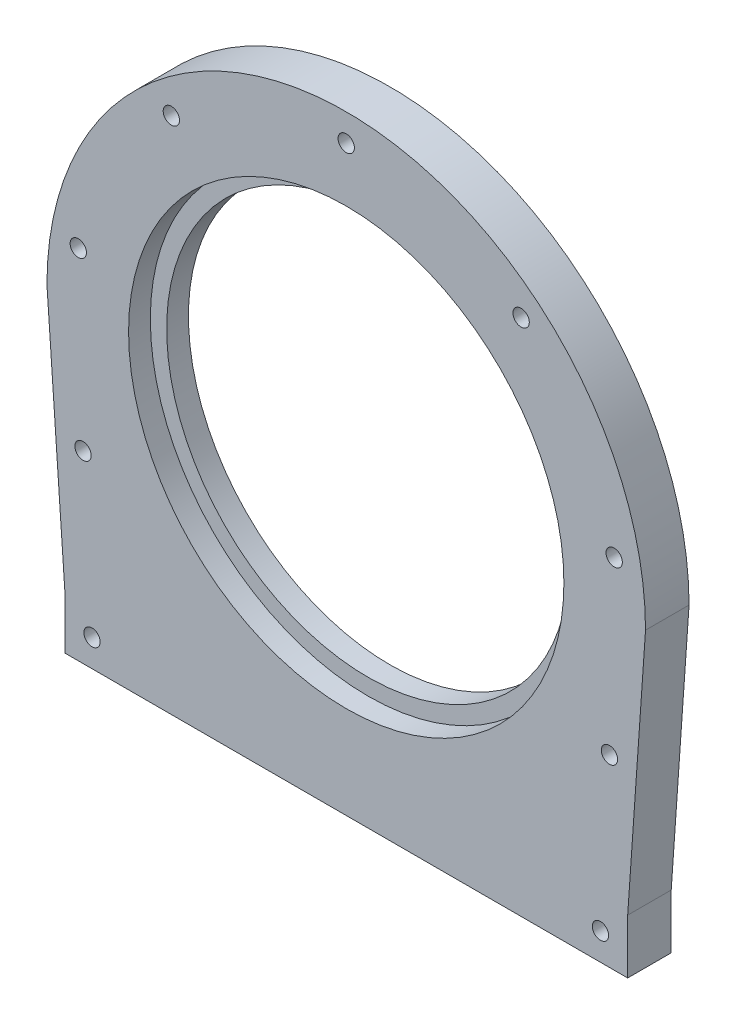
ISO-10303-21;
HEADER;
FILE_DESCRIPTION(('STEP AP214'),'2;1');
FILE_NAME('part.step','',(''),(''),'','','');
FILE_SCHEMA(('AUTOMOTIVE_DESIGN { 1 0 10303 214 1 1 1 1 }'));
ENDSEC;
DATA;
#1=APPLICATION_CONTEXT('core data for automotive mechanical design processes');
#2=APPLICATION_PROTOCOL_DEFINITION('international standard','automotive_design',2000,#1);
#3=PRODUCT_CONTEXT('',#1,'mechanical');
#4=PRODUCT('Part','Part','',(#3));
#5=PRODUCT_RELATED_PRODUCT_CATEGORY('part','',(#4));
#6=PRODUCT_DEFINITION_FORMATION('','',#4);
#7=PRODUCT_DEFINITION_CONTEXT('part definition',#1,'design');
#8=PRODUCT_DEFINITION('design','',#6,#7);
#9=PRODUCT_DEFINITION_SHAPE('','',#8);
#10=(LENGTH_UNIT() NAMED_UNIT(*) SI_UNIT(.MILLI.,.METRE.));
#11=(NAMED_UNIT(*) PLANE_ANGLE_UNIT() SI_UNIT($,.RADIAN.));
#12=(NAMED_UNIT(*) SI_UNIT($,.STERADIAN.) SOLID_ANGLE_UNIT());
#13=UNCERTAINTY_MEASURE_WITH_UNIT(LENGTH_MEASURE(1.E-05),#10,'distance_accuracy_value','');
#14=(GEOMETRIC_REPRESENTATION_CONTEXT(3) GLOBAL_UNCERTAINTY_ASSIGNED_CONTEXT((#13)) GLOBAL_UNIT_ASSIGNED_CONTEXT((#10,
#11,#12)) REPRESENTATION_CONTEXT('',''));
#15=CARTESIAN_POINT('',(0.,0.,0.));
#16=DIRECTION('',(0.,0.,1.));
#17=DIRECTION('',(1.,0.,0.));
#18=AXIS2_PLACEMENT_3D('',#15,#16,#17);
#19=CARTESIAN_POINT('',(-46.7191267927402,-52.,8.));
#20=DIRECTION('',(0.,0.,-1.));
#21=DIRECTION('',(-1.,0.,0.));
#22=AXIS2_PLACEMENT_3D('',#19,#20,#21);
#23=CYLINDRICAL_SURFACE('',#22,1.5);
#24=CARTESIAN_POINT('',(-46.7191267927402,-52.,8.));
#25=DIRECTION('',(0.,0.,1.));
#26=DIRECTION('',(1.,0.,0.));
#27=AXIS2_PLACEMENT_3D('',#24,#25,#26);
#28=CIRCLE('',#27,1.5);
#29=CARTESIAN_POINT('',(-45.2191267927402,-52.,8.));
#30=VERTEX_POINT('',#29);
#31=EDGE_CURVE('E293',#30,#30,#28,.T.);
#32=ORIENTED_EDGE('',*,*,#31,.T.);
#33=EDGE_LOOP('',(#32));
#34=FACE_BOUND('',#33,.T.);
#35=CARTESIAN_POINT('',(-46.7191267927402,-52.,4.));
#36=DIRECTION('',(0.,0.,-1.));
#37=DIRECTION('',(-1.,0.,0.));
#38=AXIS2_PLACEMENT_3D('',#35,#36,#37);
#39=CIRCLE('',#38,1.5);
#40=CARTESIAN_POINT('',(-48.2191267927402,-52.,4.));
#41=VERTEX_POINT('',#40);
#42=EDGE_CURVE('E357',#41,#41,#39,.T.);
#43=ORIENTED_EDGE('',*,*,#42,.T.);
#44=EDGE_LOOP('',(#43));
#45=FACE_BOUND('',#44,.T.);
#46=ADVANCED_FACE('F40',(#34,#45),#23,.F.);
#47=CARTESIAN_POINT('',(-48.3717011839057,-23.1518182235239,8.));
#48=DIRECTION('',(0.,0.,-1.));
#49=DIRECTION('',(-1.,0.,0.));
#50=AXIS2_PLACEMENT_3D('',#47,#48,#49);
#51=CYLINDRICAL_SURFACE('',#50,1.5);
#52=CARTESIAN_POINT('',(-48.3717011839057,-23.1518182235239,8.));
#53=DIRECTION('',(0.,0.,1.));
#54=DIRECTION('',(1.,0.,0.));
#55=AXIS2_PLACEMENT_3D('',#52,#53,#54);
#56=CIRCLE('',#55,1.5);
#57=CARTESIAN_POINT('',(-46.8717011839057,-23.1518182235239,8.));
#58=VERTEX_POINT('',#57);
#59=EDGE_CURVE('E289',#58,#58,#56,.T.);
#60=ORIENTED_EDGE('',*,*,#59,.T.);
#61=EDGE_LOOP('',(#60));
#62=FACE_BOUND('',#61,.T.);
#63=CARTESIAN_POINT('',(-48.3717011839057,-23.1518182235239,4.));
#64=DIRECTION('',(0.,0.,-1.));
#65=DIRECTION('',(-1.,0.,0.));
#66=AXIS2_PLACEMENT_3D('',#63,#64,#65);
#67=CIRCLE('',#66,1.5);
#68=CARTESIAN_POINT('',(-49.8717011839057,-23.1518182235239,4.));
#69=VERTEX_POINT('',#68);
#70=EDGE_CURVE('E337',#69,#69,#67,.T.);
#71=ORIENTED_EDGE('',*,*,#70,.T.);
#72=EDGE_LOOP('',(#71));
#73=FACE_BOUND('',#72,.T.);
#74=ADVANCED_FACE('F184',(#62,#73),#51,.F.);
#75=CARTESIAN_POINT('',(-49.2403876506049,8.68240888334158,8.));
#76=DIRECTION('',(0.,0.,-1.));
#77=DIRECTION('',(-1.,0.,0.));
#78=AXIS2_PLACEMENT_3D('',#75,#76,#77);
#79=CYLINDRICAL_SURFACE('',#78,1.50000000000543);
#80=CARTESIAN_POINT('',(-49.2403876506049,8.68240888334158,8.));
#81=DIRECTION('',(0.,0.,1.));
#82=DIRECTION('',(1.,0.,0.));
#83=AXIS2_PLACEMENT_3D('',#80,#81,#82);
#84=CIRCLE('',#83,1.50000000000543);
#85=CARTESIAN_POINT('',(-47.7403876505995,8.68240888334158,8.));
#86=VERTEX_POINT('',#85);
#87=EDGE_CURVE('E285',#86,#86,#84,.T.);
#88=ORIENTED_EDGE('',*,*,#87,.T.);
#89=EDGE_LOOP('',(#88));
#90=FACE_BOUND('',#89,.T.);
#91=CARTESIAN_POINT('',(-49.2403876506049,8.68240888334158,4.));
#92=DIRECTION('',(0.,0.,-1.));
#93=DIRECTION('',(-1.,0.,0.));
#94=AXIS2_PLACEMENT_3D('',#91,#92,#93);
#95=CIRCLE('',#94,1.50000000000543);
#96=CARTESIAN_POINT('',(-50.7403876506103,8.68240888334158,4.));
#97=VERTEX_POINT('',#96);
#98=EDGE_CURVE('E355',#97,#97,#95,.T.);
#99=ORIENTED_EDGE('',*,*,#98,.T.);
#100=EDGE_LOOP('',(#99));
#101=FACE_BOUND('',#100,.T.);
#102=ADVANCED_FACE('F191',(#90,#101),#79,.F.);
#103=CARTESIAN_POINT('',(-32.139380484325,38.3022221559452,8.));
#104=DIRECTION('',(0.,0.,-1.));
#105=DIRECTION('',(-1.,0.,0.));
#106=AXIS2_PLACEMENT_3D('',#103,#104,#105);
#107=CYLINDRICAL_SURFACE('',#106,1.5000000000019);
#108=CARTESIAN_POINT('',(-32.139380484325,38.3022221559452,8.));
#109=DIRECTION('',(0.,0.,1.));
#110=DIRECTION('',(1.,0.,0.));
#111=AXIS2_PLACEMENT_3D('',#108,#109,#110);
#112=CIRCLE('',#111,1.5000000000019);
#113=CARTESIAN_POINT('',(-30.639380484323,38.3022221559452,8.));
#114=VERTEX_POINT('',#113);
#115=EDGE_CURVE('E281',#114,#114,#112,.T.);
#116=ORIENTED_EDGE('',*,*,#115,.T.);
#117=EDGE_LOOP('',(#116));
#118=FACE_BOUND('',#117,.T.);
#119=CARTESIAN_POINT('',(-32.139380484325,38.3022221559452,4.));
#120=DIRECTION('',(0.,0.,-1.));
#121=DIRECTION('',(-1.,0.,0.));
#122=AXIS2_PLACEMENT_3D('',#119,#120,#121);
#123=CIRCLE('',#122,1.5000000000019);
#124=CARTESIAN_POINT('',(-33.6393804843268,38.3022221559452,4.));
#125=VERTEX_POINT('',#124);
#126=EDGE_CURVE('E513',#125,#125,#123,.T.);
#127=ORIENTED_EDGE('',*,*,#126,.T.);
#128=EDGE_LOOP('',(#127));
#129=FACE_BOUND('',#128,.T.);
#130=ADVANCED_FACE('F201',(#118,#129),#107,.F.);
#131=CARTESIAN_POINT('',(0.,50.,8.));
#132=DIRECTION('',(0.,0.,-1.));
#133=DIRECTION('',(-1.,0.,0.));
#134=AXIS2_PLACEMENT_3D('',#131,#132,#133);
#135=CYLINDRICAL_SURFACE('',#134,1.5);
#136=CARTESIAN_POINT('',(0.,50.,8.));
#137=DIRECTION('',(0.,0.,1.));
#138=DIRECTION('',(1.,0.,0.));
#139=AXIS2_PLACEMENT_3D('',#136,#137,#138);
#140=CIRCLE('',#139,1.5);
#141=CARTESIAN_POINT('',(1.5,50.,8.));
#142=VERTEX_POINT('',#141);
#143=EDGE_CURVE('E277',#142,#142,#140,.T.);
#144=ORIENTED_EDGE('',*,*,#143,.T.);
#145=EDGE_LOOP('',(#144));
#146=FACE_BOUND('',#145,.T.);
#147=CARTESIAN_POINT('',(0.,50.,4.));
#148=DIRECTION('',(0.,0.,-1.));
#149=DIRECTION('',(-1.,0.,0.));
#150=AXIS2_PLACEMENT_3D('',#147,#148,#149);
#151=CIRCLE('',#150,1.5);
#152=CARTESIAN_POINT('',(-1.5,50.,4.));
#153=VERTEX_POINT('',#152);
#154=EDGE_CURVE('E503',#153,#153,#151,.T.);
#155=ORIENTED_EDGE('',*,*,#154,.T.);
#156=EDGE_LOOP('',(#155));
#157=FACE_BOUND('',#156,.T.);
#158=ADVANCED_FACE('F205',(#146,#157),#135,.F.);
#159=CARTESIAN_POINT('',(32.139380484328,38.3022221559505,8.));
#160=DIRECTION('',(0.,0.,-1.));
#161=DIRECTION('',(-1.,0.,0.));
#162=AXIS2_PLACEMENT_3D('',#159,#160,#161);
#163=CYLINDRICAL_SURFACE('',#162,1.49999999999978);
#164=CARTESIAN_POINT('',(32.139380484328,38.3022221559505,8.));
#165=DIRECTION('',(0.,0.,1.));
#166=DIRECTION('',(1.,0.,0.));
#167=AXIS2_PLACEMENT_3D('',#164,#165,#166);
#168=CIRCLE('',#167,1.49999999999978);
#169=CARTESIAN_POINT('',(33.6393804843277,38.3022221559505,8.));
#170=VERTEX_POINT('',#169);
#171=EDGE_CURVE('E273',#170,#170,#168,.T.);
#172=ORIENTED_EDGE('',*,*,#171,.T.);
#173=EDGE_LOOP('',(#172));
#174=FACE_BOUND('',#173,.T.);
#175=CARTESIAN_POINT('',(32.139380484328,38.3022221559505,4.));
#176=DIRECTION('',(0.,0.,-1.));
#177=DIRECTION('',(-1.,0.,0.));
#178=AXIS2_PLACEMENT_3D('',#175,#176,#177);
#179=CIRCLE('',#178,1.49999999999978);
#180=CARTESIAN_POINT('',(30.6393804843282,38.3022221559505,4.));
#181=VERTEX_POINT('',#180);
#182=EDGE_CURVE('E493',#181,#181,#179,.T.);
#183=ORIENTED_EDGE('',*,*,#182,.T.);
#184=EDGE_LOOP('',(#183));
#185=FACE_BOUND('',#184,.T.);
#186=ADVANCED_FACE('F209',(#174,#185),#163,.F.);
#187=CARTESIAN_POINT('',(49.2403876506129,8.68240888334851,8.));
#188=DIRECTION('',(0.,0.,-1.));
#189=DIRECTION('',(-1.,0.,0.));
#190=AXIS2_PLACEMENT_3D('',#187,#188,#189);
#191=CYLINDRICAL_SURFACE('',#190,1.5000000000008);
#192=CARTESIAN_POINT('',(49.2403876506129,8.68240888334851,8.));
#193=DIRECTION('',(0.,0.,1.));
#194=DIRECTION('',(1.,0.,0.));
#195=AXIS2_PLACEMENT_3D('',#192,#193,#194);
#196=CIRCLE('',#195,1.5000000000008);
#197=CARTESIAN_POINT('',(50.7403876506137,8.68240888334851,8.));
#198=VERTEX_POINT('',#197);
#199=EDGE_CURVE('E269',#198,#198,#196,.T.);
#200=ORIENTED_EDGE('',*,*,#199,.T.);
#201=EDGE_LOOP('',(#200));
#202=FACE_BOUND('',#201,.T.);
#203=CARTESIAN_POINT('',(49.2403876506129,8.68240888334851,4.));
#204=DIRECTION('',(0.,0.,-1.));
#205=DIRECTION('',(-1.,0.,0.));
#206=AXIS2_PLACEMENT_3D('',#203,#204,#205);
#207=CIRCLE('',#206,1.5000000000008);
#208=CARTESIAN_POINT('',(47.7403876506121,8.68240888334851,4.));
#209=VERTEX_POINT('',#208);
#210=EDGE_CURVE('E483',#209,#209,#207,.T.);
#211=ORIENTED_EDGE('',*,*,#210,.T.);
#212=EDGE_LOOP('',(#211));
#213=FACE_BOUND('',#212,.T.);
#214=ADVANCED_FACE('F213',(#202,#213),#191,.F.);
#215=CARTESIAN_POINT('',(48.3717011839057,-23.1518182235239,8.));
#216=DIRECTION('',(0.,0.,-1.));
#217=DIRECTION('',(-1.,0.,0.));
#218=AXIS2_PLACEMENT_3D('',#215,#216,#217);
#219=CYLINDRICAL_SURFACE('',#218,1.5);
#220=CARTESIAN_POINT('',(48.3717011839057,-23.1518182235239,8.));
#221=DIRECTION('',(0.,0.,1.));
#222=DIRECTION('',(1.,0.,0.));
#223=AXIS2_PLACEMENT_3D('',#220,#221,#222);
#224=CIRCLE('',#223,1.5);
#225=CARTESIAN_POINT('',(49.8717011839057,-23.1518182235239,8.));
#226=VERTEX_POINT('',#225);
#227=EDGE_CURVE('E265',#226,#226,#224,.T.);
#228=ORIENTED_EDGE('',*,*,#227,.T.);
#229=EDGE_LOOP('',(#228));
#230=FACE_BOUND('',#229,.T.);
#231=CARTESIAN_POINT('',(48.3717011839057,-23.1518182235239,4.));
#232=DIRECTION('',(0.,0.,-1.));
#233=DIRECTION('',(-1.,0.,0.));
#234=AXIS2_PLACEMENT_3D('',#231,#232,#233);
#235=CIRCLE('',#234,1.5);
#236=CARTESIAN_POINT('',(46.8717011839057,-23.1518182235239,4.));
#237=VERTEX_POINT('',#236);
#238=EDGE_CURVE('E474',#237,#237,#235,.T.);
#239=ORIENTED_EDGE('',*,*,#238,.T.);
#240=EDGE_LOOP('',(#239));
#241=FACE_BOUND('',#240,.T.);
#242=ADVANCED_FACE('F217',(#230,#241),#219,.F.);
#243=CARTESIAN_POINT('',(46.7191267927402,-52.,8.));
#244=DIRECTION('',(0.,0.,-1.));
#245=DIRECTION('',(-1.,0.,0.));
#246=AXIS2_PLACEMENT_3D('',#243,#244,#245);
#247=CYLINDRICAL_SURFACE('',#246,1.5);
#248=CARTESIAN_POINT('',(46.7191267927402,-52.,8.));
#249=DIRECTION('',(0.,0.,1.));
#250=DIRECTION('',(1.,0.,0.));
#251=AXIS2_PLACEMENT_3D('',#248,#249,#250);
#252=CIRCLE('',#251,1.5);
#253=CARTESIAN_POINT('',(48.2191267927402,-52.,8.));
#254=VERTEX_POINT('',#253);
#255=EDGE_CURVE('E152',#254,#254,#252,.T.);
#256=ORIENTED_EDGE('',*,*,#255,.T.);
#257=EDGE_LOOP('',(#256));
#258=FACE_BOUND('',#257,.T.);
#259=CARTESIAN_POINT('',(46.7191267927402,-52.,4.));
#260=DIRECTION('',(0.,0.,-1.));
#261=DIRECTION('',(-1.,0.,0.));
#262=AXIS2_PLACEMENT_3D('',#259,#260,#261);
#263=CIRCLE('',#262,1.5);
#264=CARTESIAN_POINT('',(45.2191267927402,-52.,4.));
#265=VERTEX_POINT('',#264);
#266=EDGE_CURVE('E234',#265,#265,#263,.T.);
#267=ORIENTED_EDGE('',*,*,#266,.T.);
#268=EDGE_LOOP('',(#267));
#269=FACE_BOUND('',#268,.T.);
#270=ADVANCED_FACE('F220',(#258,#269),#247,.F.);
#271=CARTESIAN_POINT('',(0.,0.,8.));
#272=DIRECTION('',(0.,0.,-1.));
#273=DIRECTION('',(-1.,0.,0.));
#274=AXIS2_PLACEMENT_3D('',#271,#272,#273);
#275=CYLINDRICAL_SURFACE('',#274,37.);
#276=CARTESIAN_POINT('',(0.,0.,0.));
#277=DIRECTION('',(0.,0.,1.));
#278=DIRECTION('',(1.,0.,0.));
#279=AXIS2_PLACEMENT_3D('',#276,#277,#278);
#280=CIRCLE('',#279,37.);
#281=CARTESIAN_POINT('',(37.,0.,0.));
#282=VERTEX_POINT('',#281);
#283=EDGE_CURVE('E130',#282,#282,#280,.T.);
#284=ORIENTED_EDGE('',*,*,#283,.F.);
#285=EDGE_LOOP('',(#284));
#286=FACE_BOUND('',#285,.T.);
#287=CARTESIAN_POINT('',(0.,0.,4.));
#288=DIRECTION('',(0.,0.,1.));
#289=DIRECTION('',(1.,0.,0.));
#290=AXIS2_PLACEMENT_3D('',#287,#288,#289);
#291=CIRCLE('',#290,37.);
#292=CARTESIAN_POINT('',(37.,0.,4.));
#293=VERTEX_POINT('',#292);
#294=EDGE_CURVE('E44',#293,#293,#291,.T.);
#295=ORIENTED_EDGE('',*,*,#294,.T.);
#296=EDGE_LOOP('',(#295));
#297=FACE_BOUND('',#296,.T.);
#298=ADVANCED_FACE('F42',(#286,#297),#275,.F.);
#299=CARTESIAN_POINT('',(54.7332927911658,-3.82070199709878,8.));
#300=DIRECTION('',(-0.997572442492873,0.0696363552952254,0.));
#301=DIRECTION('',(-0.0696363552952254,-0.997572442492873,0.));
#302=AXIS2_PLACEMENT_3D('',#299,#300,#301);
#303=PLANE('',#302);
#304=DIRECTION('',(0.0696363552952254,0.997572442492873,0.));
#305=VECTOR('',#304,1.);
#306=CARTESIAN_POINT('',(54.7332927911658,-3.82070199709878,0.));
#307=LINE('',#306,#305);
#308=CARTESIAN_POINT('',(51.7191267927402,-47.,0.));
#309=VERTEX_POINT('',#308);
#310=CARTESIAN_POINT('',(55.,0.,0.));
#311=VERTEX_POINT('',#310);
#312=EDGE_CURVE('E134',#309,#311,#307,.T.);
#313=ORIENTED_EDGE('',*,*,#312,.T.);
#314=DIRECTION('',(0.,0.,-1.));
#315=VECTOR('',#314,1.);
#316=CARTESIAN_POINT('',(55.,0.,8.));
#317=LINE('',#316,#315);
#318=CARTESIAN_POINT('',(55.,0.,8.));
#319=VERTEX_POINT('',#318);
#320=EDGE_CURVE('E11',#319,#311,#317,.T.);
#321=ORIENTED_EDGE('',*,*,#320,.F.);
#322=DIRECTION('',(0.0696363552952254,0.997572442492873,0.));
#323=VECTOR('',#322,1.);
#324=CARTESIAN_POINT('',(54.7332927911658,-3.82070199709878,8.));
#325=LINE('',#324,#323);
#326=CARTESIAN_POINT('',(51.7191267927402,-47.,8.));
#327=VERTEX_POINT('',#326);
#328=EDGE_CURVE('E171',#327,#319,#325,.T.);
#329=ORIENTED_EDGE('',*,*,#328,.F.);
#330=DIRECTION('',(0.,0.,-1.));
#331=VECTOR('',#330,1.);
#332=CARTESIAN_POINT('',(51.7191267927402,-47.,8.));
#333=LINE('',#332,#331);
#334=EDGE_CURVE('E126',#327,#309,#333,.T.);
#335=ORIENTED_EDGE('',*,*,#334,.T.);
#336=EDGE_LOOP('',(#313,#321,#329,#335));
#337=FACE_BOUND('',#336,.T.);
#338=ADVANCED_FACE('F169',(#337),#303,.F.);
#339=CARTESIAN_POINT('',(0.,0.,8.));
#340=DIRECTION('',(0.,0.,-1.));
#341=DIRECTION('',(-1.,0.,0.));
#342=AXIS2_PLACEMENT_3D('',#339,#340,#341);
#343=CYLINDRICAL_SURFACE('',#342,55.);
#344=CARTESIAN_POINT('',(0.,0.,0.));
#345=DIRECTION('',(0.,0.,1.));
#346=DIRECTION('',(1.,0.,0.));
#347=AXIS2_PLACEMENT_3D('',#344,#345,#346);
#348=CIRCLE('',#347,55.);
#349=CARTESIAN_POINT('',(-55.,0.,0.));
#350=VERTEX_POINT('',#349);
#351=EDGE_CURVE('E138',#311,#350,#348,.T.);
#352=ORIENTED_EDGE('',*,*,#351,.T.);
#353=DIRECTION('',(0.,0.,-1.));
#354=VECTOR('',#353,1.);
#355=CARTESIAN_POINT('',(-55.,0.,8.));
#356=LINE('',#355,#354);
#357=CARTESIAN_POINT('',(-55.,0.,8.));
#358=VERTEX_POINT('',#357);
#359=EDGE_CURVE('E51',#358,#350,#356,.T.);
#360=ORIENTED_EDGE('',*,*,#359,.F.);
#361=CARTESIAN_POINT('',(0.,0.,8.));
#362=DIRECTION('',(0.,0.,1.));
#363=DIRECTION('',(1.,0.,0.));
#364=AXIS2_PLACEMENT_3D('',#361,#362,#363);
#365=CIRCLE('',#364,55.);
#366=EDGE_CURVE('E96',#319,#358,#365,.T.);
#367=ORIENTED_EDGE('',*,*,#366,.F.);
#368=ORIENTED_EDGE('',*,*,#320,.T.);
#369=EDGE_LOOP('',(#352,#360,#367,#368));
#370=FACE_BOUND('',#369,.T.);
#371=ADVANCED_FACE('F163',(#370),#343,.T.);
#372=CARTESIAN_POINT('',(-54.7332927911658,-3.82070199709876,8.));
#373=DIRECTION('',(-0.997572442492873,-0.0696363552952252,0.));
#374=DIRECTION('',(0.0696363552952252,-0.997572442492873,0.));
#375=AXIS2_PLACEMENT_3D('',#372,#373,#374);
#376=PLANE('',#375);
#377=DIRECTION('',(-0.0696363552952252,0.997572442492873,0.));
#378=VECTOR('',#377,1.);
#379=CARTESIAN_POINT('',(-54.7332927911658,-3.82070199709876,0.));
#380=LINE('',#379,#378);
#381=CARTESIAN_POINT('',(-51.7191267927402,-47.,0.));
#382=VERTEX_POINT('',#381);
#383=EDGE_CURVE('E142',#382,#350,#380,.T.);
#384=ORIENTED_EDGE('',*,*,#383,.F.);
#385=DIRECTION('',(0.,0.,-1.));
#386=VECTOR('',#385,1.);
#387=CARTESIAN_POINT('',(-51.7191267927402,-47.,8.));
#388=LINE('',#387,#386);
#389=CARTESIAN_POINT('',(-51.7191267927402,-47.,8.));
#390=VERTEX_POINT('',#389);
#391=EDGE_CURVE('E119',#390,#382,#388,.T.);
#392=ORIENTED_EDGE('',*,*,#391,.F.);
#393=DIRECTION('',(-0.0696363552952252,0.997572442492873,0.));
#394=VECTOR('',#393,1.);
#395=CARTESIAN_POINT('',(-54.7332927911658,-3.82070199709876,8.));
#396=LINE('',#395,#394);
#397=EDGE_CURVE('E110',#390,#358,#396,.T.);
#398=ORIENTED_EDGE('',*,*,#397,.T.);
#399=ORIENTED_EDGE('',*,*,#359,.T.);
#400=EDGE_LOOP('',(#384,#392,#398,#399));
#401=FACE_BOUND('',#400,.T.);
#402=ADVANCED_FACE('F162',(#401),#376,.T.);
#403=CARTESIAN_POINT('',(-51.7191267927402,0.,8.));
#404=DIRECTION('',(1.,0.,0.));
#405=DIRECTION('',(0.,0.,-1.));
#406=AXIS2_PLACEMENT_3D('',#403,#404,#405);
#407=PLANE('',#406);
#408=DIRECTION('',(0.,-1.,0.));
#409=VECTOR('',#408,1.);
#410=CARTESIAN_POINT('',(-51.7191267927402,0.,0.));
#411=LINE('',#410,#409);
#412=CARTESIAN_POINT('',(-51.7191267927402,-57.,0.));
#413=VERTEX_POINT('',#412);
#414=EDGE_CURVE('E117',#382,#413,#411,.T.);
#415=ORIENTED_EDGE('',*,*,#414,.T.);
#416=DIRECTION('',(0.,0.,-1.));
#417=VECTOR('',#416,1.);
#418=CARTESIAN_POINT('',(-51.7191267927402,-57.,8.));
#419=LINE('',#418,#417);
#420=CARTESIAN_POINT('',(-51.7191267927402,-57.,8.));
#421=VERTEX_POINT('',#420);
#422=EDGE_CURVE('E114',#421,#413,#419,.T.);
#423=ORIENTED_EDGE('',*,*,#422,.F.);
#424=DIRECTION('',(0.,-1.,0.));
#425=VECTOR('',#424,1.);
#426=CARTESIAN_POINT('',(-51.7191267927402,0.,8.));
#427=LINE('',#426,#425);
#428=EDGE_CURVE('E104',#390,#421,#427,.T.);
#429=ORIENTED_EDGE('',*,*,#428,.F.);
#430=ORIENTED_EDGE('',*,*,#391,.T.);
#431=EDGE_LOOP('',(#415,#423,#429,#430));
#432=FACE_BOUND('',#431,.T.);
#433=ADVANCED_FACE('F115',(#432),#407,.F.);
#434=CARTESIAN_POINT('',(0.,-57.,8.));
#435=DIRECTION('',(0.,1.,0.));
#436=DIRECTION('',(0.,0.,1.));
#437=AXIS2_PLACEMENT_3D('',#434,#435,#436);
#438=PLANE('',#437);
#439=DIRECTION('',(1.,0.,0.));
#440=VECTOR('',#439,1.);
#441=CARTESIAN_POINT('',(0.,-57.,0.));
#442=LINE('',#441,#440);
#443=CARTESIAN_POINT('',(51.7191267927402,-57.,0.));
#444=VERTEX_POINT('',#443);
#445=EDGE_CURVE('E82',#413,#444,#442,.T.);
#446=ORIENTED_EDGE('',*,*,#445,.T.);
#447=DIRECTION('',(0.,0.,-1.));
#448=VECTOR('',#447,1.);
#449=CARTESIAN_POINT('',(51.7191267927402,-57.,8.));
#450=LINE('',#449,#448);
#451=CARTESIAN_POINT('',(51.7191267927402,-57.,8.));
#452=VERTEX_POINT('',#451);
#453=EDGE_CURVE('E120',#452,#444,#450,.T.);
#454=ORIENTED_EDGE('',*,*,#453,.F.);
#455=DIRECTION('',(1.,0.,0.));
#456=VECTOR('',#455,1.);
#457=CARTESIAN_POINT('',(0.,-57.,8.));
#458=LINE('',#457,#456);
#459=EDGE_CURVE('E108',#421,#452,#458,.T.);
#460=ORIENTED_EDGE('',*,*,#459,.F.);
#461=ORIENTED_EDGE('',*,*,#422,.T.);
#462=EDGE_LOOP('',(#446,#454,#460,#461));
#463=FACE_BOUND('',#462,.T.);
#464=ADVANCED_FACE('F122',(#463),#438,.F.);
#465=CARTESIAN_POINT('',(51.7191267927402,0.,8.));
#466=DIRECTION('',(-1.,0.,0.));
#467=DIRECTION('',(0.,0.,1.));
#468=AXIS2_PLACEMENT_3D('',#465,#466,#467);
#469=PLANE('',#468);
#470=DIRECTION('',(0.,1.,0.));
#471=VECTOR('',#470,1.);
#472=CARTESIAN_POINT('',(51.7191267927402,0.,0.));
#473=LINE('',#472,#471);
#474=EDGE_CURVE('E88',#444,#309,#473,.T.);
#475=ORIENTED_EDGE('',*,*,#474,.T.);
#476=ORIENTED_EDGE('',*,*,#334,.F.);
#477=DIRECTION('',(0.,1.,0.));
#478=VECTOR('',#477,1.);
#479=CARTESIAN_POINT('',(51.7191267927402,0.,8.));
#480=LINE('',#479,#478);
#481=EDGE_CURVE('E59',#452,#327,#480,.T.);
#482=ORIENTED_EDGE('',*,*,#481,.F.);
#483=ORIENTED_EDGE('',*,*,#453,.T.);
#484=EDGE_LOOP('',(#475,#476,#482,#483));
#485=FACE_BOUND('',#484,.T.);
#486=ADVANCED_FACE('F172',(#485),#469,.F.);
#487=CARTESIAN_POINT('',(0.,0.,8.));
#488=DIRECTION('',(0.,0.,1.));
#489=DIRECTION('',(1.,0.,0.));
#490=AXIS2_PLACEMENT_3D('',#487,#488,#489);
#491=PLANE('',#490);
#492=CARTESIAN_POINT('',(0.,0.,8.));
#493=DIRECTION('',(0.,0.,1.));
#494=DIRECTION('',(1.,0.,0.));
#495=AXIS2_PLACEMENT_3D('',#492,#493,#494);
#496=CIRCLE('',#495,40.);
#497=CARTESIAN_POINT('',(40.,0.,8.));
#498=VERTEX_POINT('',#497);
#499=EDGE_CURVE('E254',#498,#498,#496,.T.);
#500=ORIENTED_EDGE('',*,*,#499,.F.);
#501=EDGE_LOOP('',(#500));
#502=FACE_BOUND('',#501,.T.);
#503=ORIENTED_EDGE('',*,*,#255,.F.);
#504=EDGE_LOOP('',(#503));
#505=FACE_BOUND('',#504,.T.);
#506=ORIENTED_EDGE('',*,*,#227,.F.);
#507=EDGE_LOOP('',(#506));
#508=FACE_BOUND('',#507,.T.);
#509=ORIENTED_EDGE('',*,*,#199,.F.);
#510=EDGE_LOOP('',(#509));
#511=FACE_BOUND('',#510,.T.);
#512=ORIENTED_EDGE('',*,*,#171,.F.);
#513=EDGE_LOOP('',(#512));
#514=FACE_BOUND('',#513,.T.);
#515=ORIENTED_EDGE('',*,*,#143,.F.);
#516=EDGE_LOOP('',(#515));
#517=FACE_BOUND('',#516,.T.);
#518=ORIENTED_EDGE('',*,*,#115,.F.);
#519=EDGE_LOOP('',(#518));
#520=FACE_BOUND('',#519,.T.);
#521=ORIENTED_EDGE('',*,*,#87,.F.);
#522=EDGE_LOOP('',(#521));
#523=FACE_BOUND('',#522,.T.);
#524=ORIENTED_EDGE('',*,*,#59,.F.);
#525=EDGE_LOOP('',(#524));
#526=FACE_BOUND('',#525,.T.);
#527=ORIENTED_EDGE('',*,*,#31,.F.);
#528=EDGE_LOOP('',(#527));
#529=FACE_BOUND('',#528,.T.);
#530=ORIENTED_EDGE('',*,*,#328,.T.);
#531=ORIENTED_EDGE('',*,*,#366,.T.);
#532=ORIENTED_EDGE('',*,*,#397,.F.);
#533=ORIENTED_EDGE('',*,*,#428,.T.);
#534=ORIENTED_EDGE('',*,*,#459,.T.);
#535=ORIENTED_EDGE('',*,*,#481,.T.);
#536=EDGE_LOOP('',(#530,#531,#532,#533,#534,#535));
#537=FACE_BOUND('',#536,.T.);
#538=ADVANCED_FACE('F106',(#502,#505,#508,#511,#514,#517,#520,#523,#526,#529,#537),#491,.T.);
#539=CARTESIAN_POINT('',(0.,0.,0.));
#540=DIRECTION('',(0.,0.,1.));
#541=DIRECTION('',(1.,0.,0.));
#542=AXIS2_PLACEMENT_3D('',#539,#540,#541);
#543=PLANE('',#542);
#544=CARTESIAN_POINT('',(-46.7191267927402,-52.,0.));
#545=DIRECTION('',(0.,0.,-1.));
#546=DIRECTION('',(-1.,0.,0.));
#547=AXIS2_PLACEMENT_3D('',#544,#545,#546);
#548=CIRCLE('',#547,3.);
#549=CARTESIAN_POINT('',(-49.7191267927402,-52.,0.));
#550=VERTEX_POINT('',#549);
#551=EDGE_CURVE('E250',#550,#550,#548,.T.);
#552=ORIENTED_EDGE('',*,*,#551,.F.);
#553=EDGE_LOOP('',(#552));
#554=FACE_BOUND('',#553,.T.);
#555=CARTESIAN_POINT('',(-48.3717011839057,-23.1518182235239,0.));
#556=DIRECTION('',(0.,0.,-1.));
#557=DIRECTION('',(-1.,0.,0.));
#558=AXIS2_PLACEMENT_3D('',#555,#556,#557);
#559=CIRCLE('',#558,3.);
#560=CARTESIAN_POINT('',(-51.3717011839057,-23.1518182235239,0.));
#561=VERTEX_POINT('',#560);
#562=EDGE_CURVE('E340',#561,#561,#559,.T.);
#563=ORIENTED_EDGE('',*,*,#562,.F.);
#564=EDGE_LOOP('',(#563));
#565=FACE_BOUND('',#564,.T.);
#566=CARTESIAN_POINT('',(-49.2403876506049,8.68240888334158,0.));
#567=DIRECTION('',(0.,0.,-1.));
#568=DIRECTION('',(-1.,0.,0.));
#569=AXIS2_PLACEMENT_3D('',#566,#567,#568);
#570=CIRCLE('',#569,3.00000000000543);
#571=CARTESIAN_POINT('',(-52.2403876506103,8.68240888334158,0.));
#572=VERTEX_POINT('',#571);
#573=EDGE_CURVE('E351',#572,#572,#570,.T.);
#574=ORIENTED_EDGE('',*,*,#573,.F.);
#575=EDGE_LOOP('',(#574));
#576=FACE_BOUND('',#575,.T.);
#577=CARTESIAN_POINT('',(-32.139380484325,38.3022221559452,0.));
#578=DIRECTION('',(0.,0.,-1.));
#579=DIRECTION('',(-1.,0.,0.));
#580=AXIS2_PLACEMENT_3D('',#577,#578,#579);
#581=CIRCLE('',#580,3.0000000000019);
#582=CARTESIAN_POINT('',(-35.1393804843269,38.3022221559452,0.));
#583=VERTEX_POINT('',#582);
#584=EDGE_CURVE('E377',#583,#583,#581,.T.);
#585=ORIENTED_EDGE('',*,*,#584,.F.);
#586=EDGE_LOOP('',(#585));
#587=FACE_BOUND('',#586,.T.);
#588=CARTESIAN_POINT('',(0.,50.,0.));
#589=DIRECTION('',(0.,0.,-1.));
#590=DIRECTION('',(-1.,0.,0.));
#591=AXIS2_PLACEMENT_3D('',#588,#589,#590);
#592=CIRCLE('',#591,3.);
#593=CARTESIAN_POINT('',(-3.,50.,0.));
#594=VERTEX_POINT('',#593);
#595=EDGE_CURVE('E381',#594,#594,#592,.T.);
#596=ORIENTED_EDGE('',*,*,#595,.F.);
#597=EDGE_LOOP('',(#596));
#598=FACE_BOUND('',#597,.T.);
#599=CARTESIAN_POINT('',(32.139380484328,38.3022221559505,0.));
#600=DIRECTION('',(0.,0.,-1.));
#601=DIRECTION('',(-1.,0.,0.));
#602=AXIS2_PLACEMENT_3D('',#599,#600,#601);
#603=CIRCLE('',#602,2.99999999999978);
#604=CARTESIAN_POINT('',(29.1393804843282,38.3022221559505,0.));
#605=VERTEX_POINT('',#604);
#606=EDGE_CURVE('E385',#605,#605,#603,.T.);
#607=ORIENTED_EDGE('',*,*,#606,.F.);
#608=EDGE_LOOP('',(#607));
#609=FACE_BOUND('',#608,.T.);
#610=CARTESIAN_POINT('',(49.2403876506129,8.68240888334851,0.));
#611=DIRECTION('',(0.,0.,-1.));
#612=DIRECTION('',(-1.,0.,0.));
#613=AXIS2_PLACEMENT_3D('',#610,#611,#612);
#614=CIRCLE('',#613,3.0000000000008);
#615=CARTESIAN_POINT('',(46.2403876506121,8.68240888334851,0.));
#616=VERTEX_POINT('',#615);
#617=EDGE_CURVE('E389',#616,#616,#614,.T.);
#618=ORIENTED_EDGE('',*,*,#617,.F.);
#619=EDGE_LOOP('',(#618));
#620=FACE_BOUND('',#619,.T.);
#621=CARTESIAN_POINT('',(48.3717011839057,-23.1518182235239,0.));
#622=DIRECTION('',(0.,0.,-1.));
#623=DIRECTION('',(-1.,0.,0.));
#624=AXIS2_PLACEMENT_3D('',#621,#622,#623);
#625=CIRCLE('',#624,3.);
#626=CARTESIAN_POINT('',(45.3717011839057,-23.1518182235239,0.));
#627=VERTEX_POINT('',#626);
#628=EDGE_CURVE('E246',#627,#627,#625,.T.);
#629=ORIENTED_EDGE('',*,*,#628,.F.);
#630=EDGE_LOOP('',(#629));
#631=FACE_BOUND('',#630,.T.);
#632=CARTESIAN_POINT('',(46.7191267927402,-52.,0.));
#633=DIRECTION('',(0.,0.,-1.));
#634=DIRECTION('',(-1.,0.,0.));
#635=AXIS2_PLACEMENT_3D('',#632,#633,#634);
#636=CIRCLE('',#635,3.);
#637=CARTESIAN_POINT('',(43.7191267927402,-52.,0.));
#638=VERTEX_POINT('',#637);
#639=EDGE_CURVE('E237',#638,#638,#636,.T.);
#640=ORIENTED_EDGE('',*,*,#639,.F.);
#641=EDGE_LOOP('',(#640));
#642=FACE_BOUND('',#641,.T.);
#643=ORIENTED_EDGE('',*,*,#283,.T.);
#644=EDGE_LOOP('',(#643));
#645=FACE_BOUND('',#644,.T.);
#646=ORIENTED_EDGE('',*,*,#312,.F.);
#647=ORIENTED_EDGE('',*,*,#474,.F.);
#648=ORIENTED_EDGE('',*,*,#445,.F.);
#649=ORIENTED_EDGE('',*,*,#414,.F.);
#650=ORIENTED_EDGE('',*,*,#383,.T.);
#651=ORIENTED_EDGE('',*,*,#351,.F.);
#652=EDGE_LOOP('',(#646,#647,#648,#649,#650,#651));
#653=FACE_BOUND('',#652,.T.);
#654=ADVANCED_FACE('F167',(#554,#565,#576,#587,#598,#609,#620,#631,#642,#645,#653),#543,.F.);
#655=CARTESIAN_POINT('',(0.,0.,4.));
#656=DIRECTION('',(0.,0.,1.));
#657=DIRECTION('',(1.,0.,0.));
#658=AXIS2_PLACEMENT_3D('',#655,#656,#657);
#659=CYLINDRICAL_SURFACE('',#658,40.);
#660=CARTESIAN_POINT('',(0.,0.,4.));
#661=DIRECTION('',(0.,0.,1.));
#662=DIRECTION('',(1.,0.,0.));
#663=AXIS2_PLACEMENT_3D('',#660,#661,#662);
#664=CIRCLE('',#663,40.);
#665=CARTESIAN_POINT('',(40.,0.,4.));
#666=VERTEX_POINT('',#665);
#667=EDGE_CURVE('E256',#666,#666,#664,.T.);
#668=ORIENTED_EDGE('',*,*,#667,.F.);
#669=EDGE_LOOP('',(#668));
#670=FACE_BOUND('',#669,.T.);
#671=ORIENTED_EDGE('',*,*,#499,.T.);
#672=EDGE_LOOP('',(#671));
#673=FACE_BOUND('',#672,.T.);
#674=ADVANCED_FACE('F309',(#670,#673),#659,.F.);
#675=CARTESIAN_POINT('',(0.,0.,4.));
#676=DIRECTION('',(0.,0.,1.));
#677=DIRECTION('',(1.,0.,0.));
#678=AXIS2_PLACEMENT_3D('',#675,#676,#677);
#679=PLANE('',#678);
#680=ORIENTED_EDGE('',*,*,#294,.F.);
#681=EDGE_LOOP('',(#680));
#682=FACE_BOUND('',#681,.T.);
#683=ORIENTED_EDGE('',*,*,#667,.T.);
#684=EDGE_LOOP('',(#683));
#685=FACE_BOUND('',#684,.T.);
#686=ADVANCED_FACE('F305',(#682,#685),#679,.T.);
#687=CARTESIAN_POINT('',(46.7191267927402,-52.,4.));
#688=DIRECTION('',(0.,0.,-1.));
#689=DIRECTION('',(-1.,0.,0.));
#690=AXIS2_PLACEMENT_3D('',#687,#688,#689);
#691=CYLINDRICAL_SURFACE('',#690,3.);
#692=CARTESIAN_POINT('',(46.7191267927402,-52.,4.));
#693=DIRECTION('',(0.,0.,-1.));
#694=DIRECTION('',(-1.,0.,0.));
#695=AXIS2_PLACEMENT_3D('',#692,#693,#694);
#696=CIRCLE('',#695,3.);
#697=CARTESIAN_POINT('',(43.7191267927402,-52.,4.));
#698=VERTEX_POINT('',#697);
#699=EDGE_CURVE('E243',#698,#698,#696,.T.);
#700=ORIENTED_EDGE('',*,*,#699,.F.);
#701=EDGE_LOOP('',(#700));
#702=FACE_BOUND('',#701,.T.);
#703=ORIENTED_EDGE('',*,*,#639,.T.);
#704=EDGE_LOOP('',(#703));
#705=FACE_BOUND('',#704,.T.);
#706=ADVANCED_FACE('F308',(#702,#705),#691,.F.);
#707=CARTESIAN_POINT('',(46.7191267927402,-52.,4.));
#708=DIRECTION('',(0.,0.,-1.));
#709=DIRECTION('',(-1.,0.,0.));
#710=AXIS2_PLACEMENT_3D('',#707,#708,#709);
#711=PLANE('',#710);
#712=ORIENTED_EDGE('',*,*,#266,.F.);
#713=EDGE_LOOP('',(#712));
#714=FACE_BOUND('',#713,.T.);
#715=ORIENTED_EDGE('',*,*,#699,.T.);
#716=EDGE_LOOP('',(#715));
#717=FACE_BOUND('',#716,.T.);
#718=ADVANCED_FACE('F398',(#714,#717),#711,.T.);
#719=CARTESIAN_POINT('',(48.3717011839057,-23.1518182235239,4.));
#720=DIRECTION('',(0.,0.,-1.));
#721=DIRECTION('',(-1.,0.,0.));
#722=AXIS2_PLACEMENT_3D('',#719,#720,#721);
#723=CYLINDRICAL_SURFACE('',#722,3.);
#724=CARTESIAN_POINT('',(48.3717011839057,-23.1518182235239,4.));
#725=DIRECTION('',(0.,0.,-1.));
#726=DIRECTION('',(-1.,0.,0.));
#727=AXIS2_PLACEMENT_3D('',#724,#725,#726);
#728=CIRCLE('',#727,3.);
#729=CARTESIAN_POINT('',(45.3717011839057,-23.1518182235239,4.));
#730=VERTEX_POINT('',#729);
#731=EDGE_CURVE('E238',#730,#730,#728,.T.);
#732=ORIENTED_EDGE('',*,*,#731,.F.);
#733=EDGE_LOOP('',(#732));
#734=FACE_BOUND('',#733,.T.);
#735=ORIENTED_EDGE('',*,*,#628,.T.);
#736=EDGE_LOOP('',(#735));
#737=FACE_BOUND('',#736,.T.);
#738=ADVANCED_FACE('F405',(#734,#737),#723,.F.);
#739=CARTESIAN_POINT('',(48.3717011839057,-23.1518182235239,4.));
#740=DIRECTION('',(0.,0.,-1.));
#741=DIRECTION('',(-1.,0.,0.));
#742=AXIS2_PLACEMENT_3D('',#739,#740,#741);
#743=PLANE('',#742);
#744=ORIENTED_EDGE('',*,*,#238,.F.);
#745=EDGE_LOOP('',(#744));
#746=FACE_BOUND('',#745,.T.);
#747=ORIENTED_EDGE('',*,*,#731,.T.);
#748=EDGE_LOOP('',(#747));
#749=FACE_BOUND('',#748,.T.);
#750=ADVANCED_FACE('F459',(#746,#749),#743,.T.);
#751=CARTESIAN_POINT('',(49.2403876506129,8.68240888334851,4.));
#752=DIRECTION('',(0.,0.,-1.));
#753=DIRECTION('',(-1.,0.,0.));
#754=AXIS2_PLACEMENT_3D('',#751,#752,#753);
#755=CYLINDRICAL_SURFACE('',#754,3.0000000000008);
#756=CARTESIAN_POINT('',(49.2403876506129,8.68240888334851,4.));
#757=DIRECTION('',(0.,0.,-1.));
#758=DIRECTION('',(-1.,0.,0.));
#759=AXIS2_PLACEMENT_3D('',#756,#757,#758);
#760=CIRCLE('',#759,3.0000000000008);
#761=CARTESIAN_POINT('',(46.2403876506121,8.68240888334851,4.));
#762=VERTEX_POINT('',#761);
#763=EDGE_CURVE('E480',#762,#762,#760,.T.);
#764=ORIENTED_EDGE('',*,*,#763,.F.);
#765=EDGE_LOOP('',(#764));
#766=FACE_BOUND('',#765,.T.);
#767=ORIENTED_EDGE('',*,*,#617,.T.);
#768=EDGE_LOOP('',(#767));
#769=FACE_BOUND('',#768,.T.);
#770=ADVANCED_FACE('F456',(#766,#769),#755,.F.);
#771=CARTESIAN_POINT('',(49.2403876506129,8.68240888334851,4.));
#772=DIRECTION('',(0.,0.,-1.));
#773=DIRECTION('',(-1.,0.,0.));
#774=AXIS2_PLACEMENT_3D('',#771,#772,#773);
#775=PLANE('',#774);
#776=ORIENTED_EDGE('',*,*,#210,.F.);
#777=EDGE_LOOP('',(#776));
#778=FACE_BOUND('',#777,.T.);
#779=ORIENTED_EDGE('',*,*,#763,.T.);
#780=EDGE_LOOP('',(#779));
#781=FACE_BOUND('',#780,.T.);
#782=ADVANCED_FACE('F451',(#778,#781),#775,.T.);
#783=CARTESIAN_POINT('',(32.139380484328,38.3022221559505,4.));
#784=DIRECTION('',(0.,0.,-1.));
#785=DIRECTION('',(-1.,0.,0.));
#786=AXIS2_PLACEMENT_3D('',#783,#784,#785);
#787=CYLINDRICAL_SURFACE('',#786,2.99999999999978);
#788=CARTESIAN_POINT('',(32.139380484328,38.3022221559505,4.));
#789=DIRECTION('',(0.,0.,-1.));
#790=DIRECTION('',(-1.,0.,0.));
#791=AXIS2_PLACEMENT_3D('',#788,#789,#790);
#792=CIRCLE('',#791,2.99999999999978);
#793=CARTESIAN_POINT('',(29.1393804843282,38.3022221559505,4.));
#794=VERTEX_POINT('',#793);
#795=EDGE_CURVE('E487',#794,#794,#792,.T.);
#796=ORIENTED_EDGE('',*,*,#795,.F.);
#797=EDGE_LOOP('',(#796));
#798=FACE_BOUND('',#797,.T.);
#799=ORIENTED_EDGE('',*,*,#606,.T.);
#800=EDGE_LOOP('',(#799));
#801=FACE_BOUND('',#800,.T.);
#802=ADVANCED_FACE('F448',(#798,#801),#787,.F.);
#803=CARTESIAN_POINT('',(32.139380484328,38.3022221559505,4.));
#804=DIRECTION('',(0.,0.,-1.));
#805=DIRECTION('',(-1.,0.,0.));
#806=AXIS2_PLACEMENT_3D('',#803,#804,#805);
#807=PLANE('',#806);
#808=ORIENTED_EDGE('',*,*,#182,.F.);
#809=EDGE_LOOP('',(#808));
#810=FACE_BOUND('',#809,.T.);
#811=ORIENTED_EDGE('',*,*,#795,.T.);
#812=EDGE_LOOP('',(#811));
#813=FACE_BOUND('',#812,.T.);
#814=ADVANCED_FACE('F443',(#810,#813),#807,.T.);
#815=CARTESIAN_POINT('',(0.,50.,4.));
#816=DIRECTION('',(0.,0.,-1.));
#817=DIRECTION('',(-1.,0.,0.));
#818=AXIS2_PLACEMENT_3D('',#815,#816,#817);
#819=CYLINDRICAL_SURFACE('',#818,3.);
#820=CARTESIAN_POINT('',(0.,50.,4.));
#821=DIRECTION('',(0.,0.,-1.));
#822=DIRECTION('',(-1.,0.,0.));
#823=AXIS2_PLACEMENT_3D('',#820,#821,#822);
#824=CIRCLE('',#823,3.);
#825=CARTESIAN_POINT('',(-3.,50.,4.));
#826=VERTEX_POINT('',#825);
#827=EDGE_CURVE('E497',#826,#826,#824,.T.);
#828=ORIENTED_EDGE('',*,*,#827,.F.);
#829=EDGE_LOOP('',(#828));
#830=FACE_BOUND('',#829,.T.);
#831=ORIENTED_EDGE('',*,*,#595,.T.);
#832=EDGE_LOOP('',(#831));
#833=FACE_BOUND('',#832,.T.);
#834=ADVANCED_FACE('F440',(#830,#833),#819,.F.);
#835=CARTESIAN_POINT('',(0.,50.,4.));
#836=DIRECTION('',(0.,0.,-1.));
#837=DIRECTION('',(-1.,0.,0.));
#838=AXIS2_PLACEMENT_3D('',#835,#836,#837);
#839=PLANE('',#838);
#840=ORIENTED_EDGE('',*,*,#154,.F.);
#841=EDGE_LOOP('',(#840));
#842=FACE_BOUND('',#841,.T.);
#843=ORIENTED_EDGE('',*,*,#827,.T.);
#844=EDGE_LOOP('',(#843));
#845=FACE_BOUND('',#844,.T.);
#846=ADVANCED_FACE('F435',(#842,#845),#839,.T.);
#847=CARTESIAN_POINT('',(-32.139380484325,38.3022221559452,4.));
#848=DIRECTION('',(0.,0.,-1.));
#849=DIRECTION('',(-1.,0.,0.));
#850=AXIS2_PLACEMENT_3D('',#847,#848,#849);
#851=CYLINDRICAL_SURFACE('',#850,3.0000000000019);
#852=CARTESIAN_POINT('',(-32.139380484325,38.3022221559452,4.));
#853=DIRECTION('',(0.,0.,-1.));
#854=DIRECTION('',(-1.,0.,0.));
#855=AXIS2_PLACEMENT_3D('',#852,#853,#854);
#856=CIRCLE('',#855,3.0000000000019);
#857=CARTESIAN_POINT('',(-35.1393804843269,38.3022221559452,4.));
#858=VERTEX_POINT('',#857);
#859=EDGE_CURVE('E507',#858,#858,#856,.T.);
#860=ORIENTED_EDGE('',*,*,#859,.F.);
#861=EDGE_LOOP('',(#860));
#862=FACE_BOUND('',#861,.T.);
#863=ORIENTED_EDGE('',*,*,#584,.T.);
#864=EDGE_LOOP('',(#863));
#865=FACE_BOUND('',#864,.T.);
#866=ADVANCED_FACE('F432',(#862,#865),#851,.F.);
#867=CARTESIAN_POINT('',(-32.139380484325,38.3022221559452,4.));
#868=DIRECTION('',(0.,0.,-1.));
#869=DIRECTION('',(-1.,0.,0.));
#870=AXIS2_PLACEMENT_3D('',#867,#868,#869);
#871=PLANE('',#870);
#872=ORIENTED_EDGE('',*,*,#126,.F.);
#873=EDGE_LOOP('',(#872));
#874=FACE_BOUND('',#873,.T.);
#875=ORIENTED_EDGE('',*,*,#859,.T.);
#876=EDGE_LOOP('',(#875));
#877=FACE_BOUND('',#876,.T.);
#878=ADVANCED_FACE('F427',(#874,#877),#871,.T.);
#879=CARTESIAN_POINT('',(-49.2403876506049,8.68240888334158,4.));
#880=DIRECTION('',(0.,0.,-1.));
#881=DIRECTION('',(-1.,0.,0.));
#882=AXIS2_PLACEMENT_3D('',#879,#880,#881);
#883=CYLINDRICAL_SURFACE('',#882,3.00000000000543);
#884=CARTESIAN_POINT('',(-49.2403876506049,8.68240888334158,4.));
#885=DIRECTION('',(0.,0.,-1.));
#886=DIRECTION('',(-1.,0.,0.));
#887=AXIS2_PLACEMENT_3D('',#884,#885,#886);
#888=CIRCLE('',#887,3.00000000000543);
#889=CARTESIAN_POINT('',(-52.2403876506103,8.68240888334158,4.));
#890=VERTEX_POINT('',#889);
#891=EDGE_CURVE('E517',#890,#890,#888,.T.);
#892=ORIENTED_EDGE('',*,*,#891,.F.);
#893=EDGE_LOOP('',(#892));
#894=FACE_BOUND('',#893,.T.);
#895=ORIENTED_EDGE('',*,*,#573,.T.);
#896=EDGE_LOOP('',(#895));
#897=FACE_BOUND('',#896,.T.);
#898=ADVANCED_FACE('F424',(#894,#897),#883,.F.);
#899=CARTESIAN_POINT('',(-49.2403876506049,8.68240888334158,4.));
#900=DIRECTION('',(0.,0.,-1.));
#901=DIRECTION('',(-1.,0.,0.));
#902=AXIS2_PLACEMENT_3D('',#899,#900,#901);
#903=PLANE('',#902);
#904=ORIENTED_EDGE('',*,*,#98,.F.);
#905=EDGE_LOOP('',(#904));
#906=FACE_BOUND('',#905,.T.);
#907=ORIENTED_EDGE('',*,*,#891,.T.);
#908=EDGE_LOOP('',(#907));
#909=FACE_BOUND('',#908,.T.);
#910=ADVANCED_FACE('F420',(#906,#909),#903,.T.);
#911=CARTESIAN_POINT('',(-48.3717011839057,-23.1518182235239,4.));
#912=DIRECTION('',(0.,0.,-1.));
#913=DIRECTION('',(-1.,0.,0.));
#914=AXIS2_PLACEMENT_3D('',#911,#912,#913);
#915=CYLINDRICAL_SURFACE('',#914,3.);
#916=CARTESIAN_POINT('',(-48.3717011839057,-23.1518182235239,4.));
#917=DIRECTION('',(0.,0.,-1.));
#918=DIRECTION('',(-1.,0.,0.));
#919=AXIS2_PLACEMENT_3D('',#916,#917,#918);
#920=CIRCLE('',#919,3.);
#921=CARTESIAN_POINT('',(-51.3717011839057,-23.1518182235239,4.));
#922=VERTEX_POINT('',#921);
#923=EDGE_CURVE('E346',#922,#922,#920,.T.);
#924=ORIENTED_EDGE('',*,*,#923,.F.);
#925=EDGE_LOOP('',(#924));
#926=FACE_BOUND('',#925,.T.);
#927=ORIENTED_EDGE('',*,*,#562,.T.);
#928=EDGE_LOOP('',(#927));
#929=FACE_BOUND('',#928,.T.);
#930=ADVANCED_FACE('F417',(#926,#929),#915,.F.);
#931=CARTESIAN_POINT('',(-48.3717011839057,-23.1518182235239,4.));
#932=DIRECTION('',(0.,0.,-1.));
#933=DIRECTION('',(-1.,0.,0.));
#934=AXIS2_PLACEMENT_3D('',#931,#932,#933);
#935=PLANE('',#934);
#936=ORIENTED_EDGE('',*,*,#70,.F.);
#937=EDGE_LOOP('',(#936));
#938=FACE_BOUND('',#937,.T.);
#939=ORIENTED_EDGE('',*,*,#923,.T.);
#940=EDGE_LOOP('',(#939));
#941=FACE_BOUND('',#940,.T.);
#942=ADVANCED_FACE('F412',(#938,#941),#935,.T.);
#943=CARTESIAN_POINT('',(-46.7191267927402,-52.,4.));
#944=DIRECTION('',(0.,0.,-1.));
#945=DIRECTION('',(-1.,0.,0.));
#946=AXIS2_PLACEMENT_3D('',#943,#944,#945);
#947=CYLINDRICAL_SURFACE('',#946,3.);
#948=CARTESIAN_POINT('',(-46.7191267927402,-52.,4.));
#949=DIRECTION('',(0.,0.,-1.));
#950=DIRECTION('',(-1.,0.,0.));
#951=AXIS2_PLACEMENT_3D('',#948,#949,#950);
#952=CIRCLE('',#951,3.);
#953=CARTESIAN_POINT('',(-49.7191267927402,-52.,4.));
#954=VERTEX_POINT('',#953);
#955=EDGE_CURVE('E341',#954,#954,#952,.T.);
#956=ORIENTED_EDGE('',*,*,#955,.F.);
#957=EDGE_LOOP('',(#956));
#958=FACE_BOUND('',#957,.T.);
#959=ORIENTED_EDGE('',*,*,#551,.T.);
#960=EDGE_LOOP('',(#959));
#961=FACE_BOUND('',#960,.T.);
#962=ADVANCED_FACE('F365',(#958,#961),#947,.F.);
#963=CARTESIAN_POINT('',(-46.7191267927402,-52.,4.));
#964=DIRECTION('',(0.,0.,-1.));
#965=DIRECTION('',(-1.,0.,0.));
#966=AXIS2_PLACEMENT_3D('',#963,#964,#965);
#967=PLANE('',#966);
#968=ORIENTED_EDGE('',*,*,#42,.F.);
#969=EDGE_LOOP('',(#968));
#970=FACE_BOUND('',#969,.T.);
#971=ORIENTED_EDGE('',*,*,#955,.T.);
#972=EDGE_LOOP('',(#971));
#973=FACE_BOUND('',#972,.T.);
#974=ADVANCED_FACE('F411',(#970,#973),#967,.T.);
#975=CLOSED_SHELL('',(#46,#74,#102,#130,#158,#186,#214,#242,#270,#298,#338,#371,#402,#433,#464,
#486,#538,#654,#674,#686,#706,#718,#738,#750,#770,#782,#802,#814,#834,#846,#866,#878,#898,#910,
#930,#942,#962,#974));
#976=MANIFOLD_SOLID_BREP('B2',#975);
#977=ADVANCED_BREP_SHAPE_REPRESENTATION('',(#18,#976),#14);
#978=SHAPE_DEFINITION_REPRESENTATION(#9,#977);
ENDSEC;
END-ISO-10303-21;
